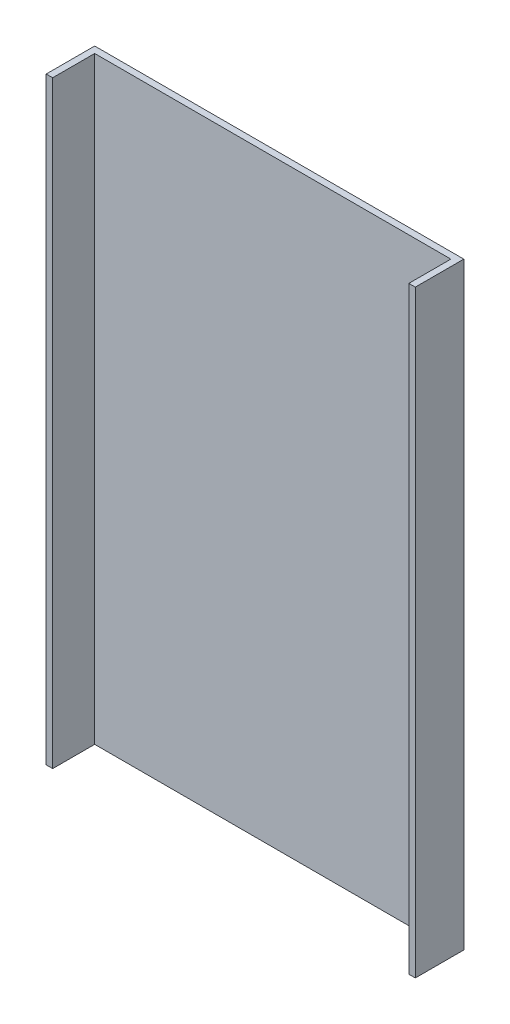
ISO-10303-21;
HEADER;
FILE_DESCRIPTION(('STEP AP214'),'2;1');
FILE_NAME('part.step','',(''),(''),'','','');
FILE_SCHEMA(('AUTOMOTIVE_DESIGN { 1 0 10303 214 1 1 1 1 }'));
ENDSEC;
DATA;
#1=APPLICATION_CONTEXT('core data for automotive mechanical design processes');
#2=APPLICATION_PROTOCOL_DEFINITION('international standard','automotive_design',2000,#1);
#3=PRODUCT_CONTEXT('',#1,'mechanical');
#4=PRODUCT('Part','Part','',(#3));
#5=PRODUCT_RELATED_PRODUCT_CATEGORY('part','',(#4));
#6=PRODUCT_DEFINITION_FORMATION('','',#4);
#7=PRODUCT_DEFINITION_CONTEXT('part definition',#1,'design');
#8=PRODUCT_DEFINITION('design','',#6,#7);
#9=PRODUCT_DEFINITION_SHAPE('','',#8);
#10=(LENGTH_UNIT() NAMED_UNIT(*) SI_UNIT(.MILLI.,.METRE.));
#11=(NAMED_UNIT(*) PLANE_ANGLE_UNIT() SI_UNIT($,.RADIAN.));
#12=(NAMED_UNIT(*) SI_UNIT($,.STERADIAN.) SOLID_ANGLE_UNIT());
#13=UNCERTAINTY_MEASURE_WITH_UNIT(LENGTH_MEASURE(1.E-05),#10,'distance_accuracy_value','');
#14=(GEOMETRIC_REPRESENTATION_CONTEXT(3) GLOBAL_UNCERTAINTY_ASSIGNED_CONTEXT((#13)) GLOBAL_UNIT_ASSIGNED_CONTEXT((#10,
#11,#12)) REPRESENTATION_CONTEXT('',''));
#15=CARTESIAN_POINT('',(0.,0.,0.));
#16=DIRECTION('',(0.,0.,1.));
#17=DIRECTION('',(1.,0.,0.));
#18=AXIS2_PLACEMENT_3D('',#15,#16,#17);
#19=CARTESIAN_POINT('',(0.,0.,1.27));
#20=DIRECTION('',(0.,0.,-1.));
#21=DIRECTION('',(-1.,0.,0.));
#22=AXIS2_PLACEMENT_3D('',#19,#20,#21);
#23=PLANE('',#22);
#24=DIRECTION('',(0.,1.,0.));
#25=VECTOR('',#24,1.);
#26=CARTESIAN_POINT('',(1.27,117.46,1.27));
#27=LINE('',#26,#25);
#28=CARTESIAN_POINT('',(1.27000000000001,0.,1.27));
#29=VERTEX_POINT('',#28);
#30=CARTESIAN_POINT('',(1.27,117.46,1.27));
#31=VERTEX_POINT('',#30);
#32=EDGE_CURVE('E59',#29,#31,#27,.T.);
#33=ORIENTED_EDGE('',*,*,#32,.F.);
#34=DIRECTION('',(1.,0.,0.));
#35=VECTOR('',#34,1.);
#36=CARTESIAN_POINT('',(0.,0.,1.27));
#37=LINE('',#36,#35);
#38=CARTESIAN_POINT('',(71.19,0.,1.27));
#39=VERTEX_POINT('',#38);
#40=EDGE_CURVE('E149',#29,#39,#37,.T.);
#41=ORIENTED_EDGE('',*,*,#40,.T.);
#42=DIRECTION('',(0.,-1.,0.));
#43=VECTOR('',#42,1.);
#44=CARTESIAN_POINT('',(71.19,0.,1.27));
#45=LINE('',#44,#43);
#46=CARTESIAN_POINT('',(71.19,117.46,1.27));
#47=VERTEX_POINT('',#46);
#48=EDGE_CURVE('E54',#47,#39,#45,.T.);
#49=ORIENTED_EDGE('',*,*,#48,.F.);
#50=DIRECTION('',(-1.,0.,0.));
#51=VECTOR('',#50,1.);
#52=CARTESIAN_POINT('',(0.,117.46,1.27));
#53=LINE('',#52,#51);
#54=EDGE_CURVE('E151',#47,#31,#53,.T.);
#55=ORIENTED_EDGE('',*,*,#54,.T.);
#56=EDGE_LOOP('',(#33,#41,#49,#55));
#57=FACE_BOUND('',#56,.T.);
#58=ADVANCED_FACE('F39',(#57),#23,.F.);
#59=CARTESIAN_POINT('',(0.,0.,1.27));
#60=DIRECTION('',(1.,0.,0.));
#61=DIRECTION('',(0.,0.,-1.));
#62=AXIS2_PLACEMENT_3D('',#59,#60,#61);
#63=PLANE('',#62);
#64=DIRECTION('',(0.,-1.,0.));
#65=VECTOR('',#64,1.);
#66=CARTESIAN_POINT('',(0.,0.,0.));
#67=LINE('',#66,#65);
#68=CARTESIAN_POINT('',(0.,117.46,0.));
#69=VERTEX_POINT('',#68);
#70=CARTESIAN_POINT('',(0.,0.,0.));
#71=VERTEX_POINT('',#70);
#72=EDGE_CURVE('E108',#69,#71,#67,.T.);
#73=ORIENTED_EDGE('',*,*,#72,.T.);
#74=DIRECTION('',(0.,0.,-1.));
#75=VECTOR('',#74,1.);
#76=CARTESIAN_POINT('',(0.,0.,1.27));
#77=LINE('',#76,#75);
#78=CARTESIAN_POINT('',(0.,0.,9.52));
#79=VERTEX_POINT('',#78);
#80=EDGE_CURVE('E11',#79,#71,#77,.T.);
#81=ORIENTED_EDGE('',*,*,#80,.F.);
#82=DIRECTION('',(0.,-1.,0.));
#83=VECTOR('',#82,1.);
#84=CARTESIAN_POINT('',(0.,117.46,9.52));
#85=LINE('',#84,#83);
#86=CARTESIAN_POINT('',(0.,117.46,9.52));
#87=VERTEX_POINT('',#86);
#88=EDGE_CURVE('E106',#87,#79,#85,.T.);
#89=ORIENTED_EDGE('',*,*,#88,.F.);
#90=DIRECTION('',(0.,0.,-1.));
#91=VECTOR('',#90,1.);
#92=CARTESIAN_POINT('',(0.,117.46,1.27));
#93=LINE('',#92,#91);
#94=EDGE_CURVE('E154',#87,#69,#93,.T.);
#95=ORIENTED_EDGE('',*,*,#94,.T.);
#96=EDGE_LOOP('',(#73,#81,#89,#95));
#97=FACE_BOUND('',#96,.T.);
#98=ADVANCED_FACE('F41',(#97),#63,.F.);
#99=CARTESIAN_POINT('',(0.,0.,1.27));
#100=DIRECTION('',(0.,1.,0.));
#101=DIRECTION('',(0.,0.,1.));
#102=AXIS2_PLACEMENT_3D('',#99,#100,#101);
#103=PLANE('',#102);
#104=DIRECTION('',(1.,0.,0.));
#105=VECTOR('',#104,1.);
#106=CARTESIAN_POINT('',(0.,0.,0.));
#107=LINE('',#106,#105);
#108=CARTESIAN_POINT('',(72.46,0.,0.));
#109=VERTEX_POINT('',#108);
#110=EDGE_CURVE('E156',#71,#109,#107,.T.);
#111=ORIENTED_EDGE('',*,*,#110,.T.);
#112=DIRECTION('',(0.,0.,-1.));
#113=VECTOR('',#112,1.);
#114=CARTESIAN_POINT('',(72.46,0.,1.27));
#115=LINE('',#114,#113);
#116=CARTESIAN_POINT('',(72.46,0.,9.52));
#117=VERTEX_POINT('',#116);
#118=EDGE_CURVE('E47',#117,#109,#115,.T.);
#119=ORIENTED_EDGE('',*,*,#118,.F.);
#120=DIRECTION('',(1.,0.,0.));
#121=VECTOR('',#120,1.);
#122=CARTESIAN_POINT('',(72.46,0.,9.52));
#123=LINE('',#122,#121);
#124=CARTESIAN_POINT('',(71.19,0.,9.52));
#125=VERTEX_POINT('',#124);
#126=EDGE_CURVE('E138',#125,#117,#123,.T.);
#127=ORIENTED_EDGE('',*,*,#126,.F.);
#128=DIRECTION('',(0.,0.,-1.));
#129=VECTOR('',#128,1.);
#130=CARTESIAN_POINT('',(71.19,0.,9.52));
#131=LINE('',#130,#129);
#132=EDGE_CURVE('E135',#125,#39,#131,.T.);
#133=ORIENTED_EDGE('',*,*,#132,.T.);
#134=ORIENTED_EDGE('',*,*,#40,.F.);
#135=DIRECTION('',(0.,0.,-1.));
#136=VECTOR('',#135,1.);
#137=CARTESIAN_POINT('',(1.27000000000001,0.,9.52));
#138=LINE('',#137,#136);
#139=CARTESIAN_POINT('',(1.27000000000001,0.,9.52));
#140=VERTEX_POINT('',#139);
#141=EDGE_CURVE('E114',#140,#29,#138,.T.);
#142=ORIENTED_EDGE('',*,*,#141,.F.);
#143=DIRECTION('',(1.,0.,0.));
#144=VECTOR('',#143,1.);
#145=CARTESIAN_POINT('',(0.,0.,9.52));
#146=LINE('',#145,#144);
#147=EDGE_CURVE('E111',#79,#140,#146,.T.);
#148=ORIENTED_EDGE('',*,*,#147,.F.);
#149=ORIENTED_EDGE('',*,*,#80,.T.);
#150=EDGE_LOOP('',(#111,#119,#127,#133,#134,#142,#148,#149));
#151=FACE_BOUND('',#150,.T.);
#152=ADVANCED_FACE('F112',(#151),#103,.F.);
#153=CARTESIAN_POINT('',(72.46,0.,1.27));
#154=DIRECTION('',(-1.,0.,0.));
#155=DIRECTION('',(0.,0.,1.));
#156=AXIS2_PLACEMENT_3D('',#153,#154,#155);
#157=PLANE('',#156);
#158=DIRECTION('',(0.,1.,0.));
#159=VECTOR('',#158,1.);
#160=CARTESIAN_POINT('',(72.46,0.,0.));
#161=LINE('',#160,#159);
#162=CARTESIAN_POINT('',(72.46,117.46,0.));
#163=VERTEX_POINT('',#162);
#164=EDGE_CURVE('E158',#109,#163,#161,.T.);
#165=ORIENTED_EDGE('',*,*,#164,.T.);
#166=DIRECTION('',(0.,0.,-1.));
#167=VECTOR('',#166,1.);
#168=CARTESIAN_POINT('',(72.46,117.46,1.27));
#169=LINE('',#168,#167);
#170=CARTESIAN_POINT('',(72.46,117.46,9.52));
#171=VERTEX_POINT('',#170);
#172=EDGE_CURVE('E162',#171,#163,#169,.T.);
#173=ORIENTED_EDGE('',*,*,#172,.F.);
#174=DIRECTION('',(0.,1.,0.));
#175=VECTOR('',#174,1.);
#176=CARTESIAN_POINT('',(72.46,0.,9.52));
#177=LINE('',#176,#175);
#178=EDGE_CURVE('E140',#117,#171,#177,.T.);
#179=ORIENTED_EDGE('',*,*,#178,.F.);
#180=ORIENTED_EDGE('',*,*,#118,.T.);
#181=EDGE_LOOP('',(#165,#173,#179,#180));
#182=FACE_BOUND('',#181,.T.);
#183=ADVANCED_FACE('F168',(#182),#157,.F.);
#184=CARTESIAN_POINT('',(0.,117.46,1.27));
#185=DIRECTION('',(0.,-1.,0.));
#186=DIRECTION('',(0.,0.,-1.));
#187=AXIS2_PLACEMENT_3D('',#184,#185,#186);
#188=PLANE('',#187);
#189=DIRECTION('',(-1.,0.,0.));
#190=VECTOR('',#189,1.);
#191=CARTESIAN_POINT('',(0.,117.46,0.));
#192=LINE('',#191,#190);
#193=EDGE_CURVE('E152',#163,#69,#192,.T.);
#194=ORIENTED_EDGE('',*,*,#193,.T.);
#195=ORIENTED_EDGE('',*,*,#94,.F.);
#196=DIRECTION('',(-1.,0.,0.));
#197=VECTOR('',#196,1.);
#198=CARTESIAN_POINT('',(0.,117.46,9.52));
#199=LINE('',#198,#197);
#200=CARTESIAN_POINT('',(1.27,117.46,9.52));
#201=VERTEX_POINT('',#200);
#202=EDGE_CURVE('E122',#201,#87,#199,.T.);
#203=ORIENTED_EDGE('',*,*,#202,.F.);
#204=DIRECTION('',(0.,0.,-1.));
#205=VECTOR('',#204,1.);
#206=CARTESIAN_POINT('',(1.27,117.46,9.52));
#207=LINE('',#206,#205);
#208=EDGE_CURVE('E127',#201,#31,#207,.T.);
#209=ORIENTED_EDGE('',*,*,#208,.T.);
#210=ORIENTED_EDGE('',*,*,#54,.F.);
#211=DIRECTION('',(0.,0.,-1.));
#212=VECTOR('',#211,1.);
#213=CARTESIAN_POINT('',(71.19,117.46,9.52));
#214=LINE('',#213,#212);
#215=CARTESIAN_POINT('',(71.19,117.46,9.52));
#216=VERTEX_POINT('',#215);
#217=EDGE_CURVE('E132',#216,#47,#214,.T.);
#218=ORIENTED_EDGE('',*,*,#217,.F.);
#219=DIRECTION('',(-1.,0.,0.));
#220=VECTOR('',#219,1.);
#221=CARTESIAN_POINT('',(72.46,117.46,9.52));
#222=LINE('',#221,#220);
#223=EDGE_CURVE('E145',#171,#216,#222,.T.);
#224=ORIENTED_EDGE('',*,*,#223,.F.);
#225=ORIENTED_EDGE('',*,*,#172,.T.);
#226=EDGE_LOOP('',(#194,#195,#203,#209,#210,#218,#224,#225));
#227=FACE_BOUND('',#226,.T.);
#228=ADVANCED_FACE('F174',(#227),#188,.F.);
#229=CARTESIAN_POINT('',(0.,0.,0.));
#230=DIRECTION('',(0.,0.,-1.));
#231=DIRECTION('',(-1.,0.,0.));
#232=AXIS2_PLACEMENT_3D('',#229,#230,#231);
#233=PLANE('',#232);
#234=ORIENTED_EDGE('',*,*,#72,.F.);
#235=ORIENTED_EDGE('',*,*,#193,.F.);
#236=ORIENTED_EDGE('',*,*,#164,.F.);
#237=ORIENTED_EDGE('',*,*,#110,.F.);
#238=EDGE_LOOP('',(#234,#235,#236,#237));
#239=FACE_BOUND('',#238,.T.);
#240=ADVANCED_FACE('F172',(#239),#233,.T.);
#241=CARTESIAN_POINT('',(71.19,0.,9.52));
#242=DIRECTION('',(1.,0.,0.));
#243=DIRECTION('',(0.,0.,-1.));
#244=AXIS2_PLACEMENT_3D('',#241,#242,#243);
#245=PLANE('',#244);
#246=ORIENTED_EDGE('',*,*,#48,.T.);
#247=ORIENTED_EDGE('',*,*,#132,.F.);
#248=DIRECTION('',(0.,-1.,0.));
#249=VECTOR('',#248,1.);
#250=CARTESIAN_POINT('',(71.19,0.,9.52));
#251=LINE('',#250,#249);
#252=EDGE_CURVE('E143',#216,#125,#251,.T.);
#253=ORIENTED_EDGE('',*,*,#252,.F.);
#254=ORIENTED_EDGE('',*,*,#217,.T.);
#255=EDGE_LOOP('',(#246,#247,#253,#254));
#256=FACE_BOUND('',#255,.T.);
#257=ADVANCED_FACE('F182',(#256),#245,.F.);
#258=CARTESIAN_POINT('',(0.,0.,9.52));
#259=DIRECTION('',(0.,0.,1.));
#260=DIRECTION('',(1.,0.,0.));
#261=AXIS2_PLACEMENT_3D('',#258,#259,#260);
#262=PLANE('',#261);
#263=ORIENTED_EDGE('',*,*,#178,.T.);
#264=ORIENTED_EDGE('',*,*,#223,.T.);
#265=ORIENTED_EDGE('',*,*,#252,.T.);
#266=ORIENTED_EDGE('',*,*,#126,.T.);
#267=EDGE_LOOP('',(#263,#264,#265,#266));
#268=FACE_BOUND('',#267,.T.);
#269=ADVANCED_FACE('F179',(#268),#262,.T.);
#270=CARTESIAN_POINT('',(1.27,117.46,9.52));
#271=DIRECTION('',(-1.,0.,0.));
#272=DIRECTION('',(0.,-1.,0.));
#273=AXIS2_PLACEMENT_3D('',#270,#271,#272);
#274=PLANE('',#273);
#275=ORIENTED_EDGE('',*,*,#32,.T.);
#276=ORIENTED_EDGE('',*,*,#208,.F.);
#277=DIRECTION('',(0.,1.,0.));
#278=VECTOR('',#277,1.);
#279=CARTESIAN_POINT('',(1.27,117.46,9.52));
#280=LINE('',#279,#278);
#281=EDGE_CURVE('E117',#140,#201,#280,.T.);
#282=ORIENTED_EDGE('',*,*,#281,.F.);
#283=ORIENTED_EDGE('',*,*,#141,.T.);
#284=EDGE_LOOP('',(#275,#276,#282,#283));
#285=FACE_BOUND('',#284,.T.);
#286=ADVANCED_FACE('F189',(#285),#274,.F.);
#287=CARTESIAN_POINT('',(0.,0.,9.52));
#288=DIRECTION('',(0.,0.,1.));
#289=DIRECTION('',(1.,0.,0.));
#290=AXIS2_PLACEMENT_3D('',#287,#288,#289);
#291=PLANE('',#290);
#292=ORIENTED_EDGE('',*,*,#88,.T.);
#293=ORIENTED_EDGE('',*,*,#147,.T.);
#294=ORIENTED_EDGE('',*,*,#281,.T.);
#295=ORIENTED_EDGE('',*,*,#202,.T.);
#296=EDGE_LOOP('',(#292,#293,#294,#295));
#297=FACE_BOUND('',#296,.T.);
#298=ADVANCED_FACE('F120',(#297),#291,.T.);
#299=CLOSED_SHELL('',(#58,#98,#152,#183,#228,#240,#257,#269,#286,#298));
#300=MANIFOLD_SOLID_BREP('B2',#299);
#301=ADVANCED_BREP_SHAPE_REPRESENTATION('',(#18,#300),#14);
#302=SHAPE_DEFINITION_REPRESENTATION(#9,#301);
ENDSEC;
END-ISO-10303-21;
